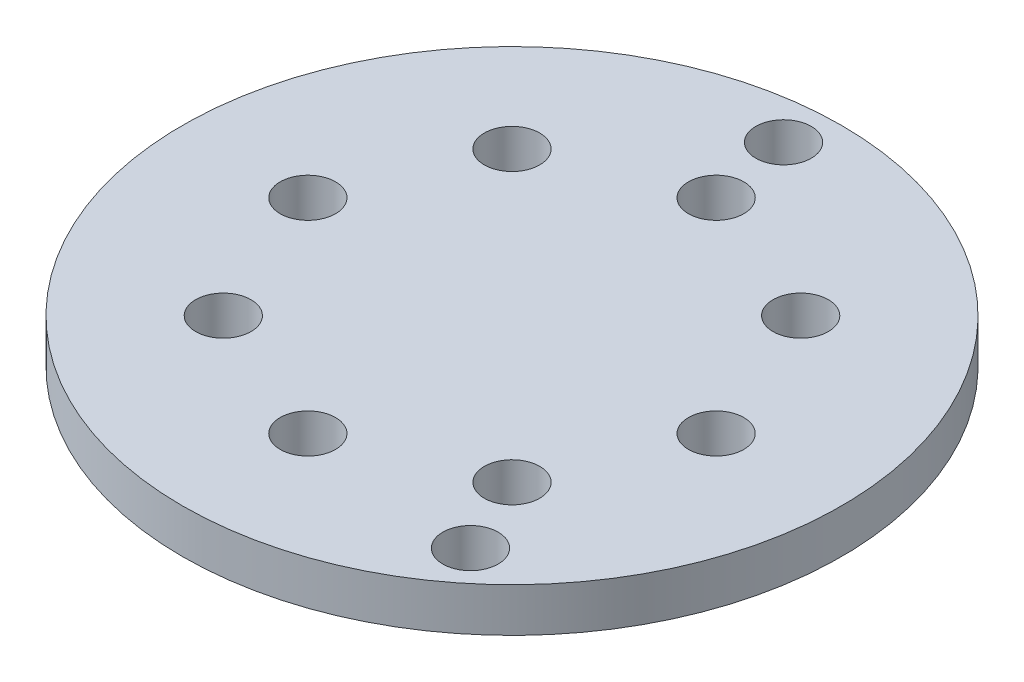
ISO-10303-21;
HEADER;
FILE_DESCRIPTION(('STEP AP214'),'2;1');
FILE_NAME('part.step','',(''),(''),'','','');
FILE_SCHEMA(('AUTOMOTIVE_DESIGN { 1 0 10303 214 1 1 1 1 }'));
ENDSEC;
DATA;
#1=APPLICATION_CONTEXT('core data for automotive mechanical design processes');
#2=APPLICATION_PROTOCOL_DEFINITION('international standard','automotive_design',2000,#1);
#3=PRODUCT_CONTEXT('',#1,'mechanical');
#4=PRODUCT('Part','Part','',(#3));
#5=PRODUCT_RELATED_PRODUCT_CATEGORY('part','',(#4));
#6=PRODUCT_DEFINITION_FORMATION('','',#4);
#7=PRODUCT_DEFINITION_CONTEXT('part definition',#1,'design');
#8=PRODUCT_DEFINITION('design','',#6,#7);
#9=PRODUCT_DEFINITION_SHAPE('','',#8);
#10=(LENGTH_UNIT() NAMED_UNIT(*) SI_UNIT(.MILLI.,.METRE.));
#11=(NAMED_UNIT(*) PLANE_ANGLE_UNIT() SI_UNIT($,.RADIAN.));
#12=(NAMED_UNIT(*) SI_UNIT($,.STERADIAN.) SOLID_ANGLE_UNIT());
#13=UNCERTAINTY_MEASURE_WITH_UNIT(LENGTH_MEASURE(1.E-05),#10,'distance_accuracy_value','');
#14=(GEOMETRIC_REPRESENTATION_CONTEXT(3) GLOBAL_UNCERTAINTY_ASSIGNED_CONTEXT((#13)) GLOBAL_UNIT_ASSIGNED_CONTEXT((#10,
#11,#12)) REPRESENTATION_CONTEXT('',''));
#15=CARTESIAN_POINT('',(0.,0.,0.));
#16=DIRECTION('',(0.,0.,1.));
#17=DIRECTION('',(1.,0.,0.));
#18=AXIS2_PLACEMENT_3D('',#15,#16,#17);
#19=CARTESIAN_POINT('',(0.,6.35,0.));
#20=DIRECTION('',(0.,-1.,0.));
#21=DIRECTION('',(0.,0.,-1.));
#22=AXIS2_PLACEMENT_3D('',#19,#20,#21);
#23=CYLINDRICAL_SURFACE('',#22,47.625);
#24=CARTESIAN_POINT('',(0.,6.35,0.));
#25=DIRECTION('',(0.,1.,0.));
#26=DIRECTION('',(0.,0.,1.));
#27=AXIS2_PLACEMENT_3D('',#24,#25,#26);
#28=CIRCLE('',#27,47.625);
#29=CARTESIAN_POINT('',(0.,6.35,47.625));
#30=VERTEX_POINT('',#29);
#31=EDGE_CURVE('E10',#30,#30,#28,.T.);
#32=ORIENTED_EDGE('',*,*,#31,.F.);
#33=EDGE_LOOP('',(#32));
#34=FACE_BOUND('',#33,.T.);
#35=CARTESIAN_POINT('',(0.,0.,0.));
#36=DIRECTION('',(0.,1.,0.));
#37=DIRECTION('',(0.,0.,1.));
#38=AXIS2_PLACEMENT_3D('',#35,#36,#37);
#39=CIRCLE('',#38,47.625);
#40=CARTESIAN_POINT('',(0.,0.,47.625));
#41=VERTEX_POINT('',#40);
#42=EDGE_CURVE('E48',#41,#41,#39,.T.);
#43=ORIENTED_EDGE('',*,*,#42,.T.);
#44=EDGE_LOOP('',(#43));
#45=FACE_BOUND('',#44,.T.);
#46=ADVANCED_FACE('F45',(#34,#45),#23,.T.);
#47=CARTESIAN_POINT('',(0.,6.35,0.));
#48=DIRECTION('',(0.,1.,0.));
#49=DIRECTION('',(0.,0.,1.));
#50=AXIS2_PLACEMENT_3D('',#47,#48,#49);
#51=PLANE('',#50);
#52=CARTESIAN_POINT('',(26.0949031134328,6.35,32.0940532608543));
#53=DIRECTION('',(0.,1.,0.));
#54=DIRECTION('',(0.,0.,1.));
#55=AXIS2_PLACEMENT_3D('',#52,#53,#54);
#56=CIRCLE('',#55,4.);
#57=CARTESIAN_POINT('',(26.0949031134328,6.35,36.0940532608543));
#58=VERTEX_POINT('',#57);
#59=EDGE_CURVE('E131',#58,#58,#56,.T.);
#60=ORIENTED_EDGE('',*,*,#59,.F.);
#61=EDGE_LOOP('',(#60));
#62=FACE_BOUND('',#61,.T.);
#63=CARTESIAN_POINT('',(-2.07250568925483,6.35,-41.3119467391456));
#64=DIRECTION('',(0.,1.,0.));
#65=DIRECTION('',(0.,0.,1.));
#66=AXIS2_PLACEMENT_3D('',#63,#64,#65);
#67=CIRCLE('',#66,4.);
#68=CARTESIAN_POINT('',(-2.07250568925483,6.35,-37.3119467391456));
#69=VERTEX_POINT('',#68);
#70=EDGE_CURVE('E123',#69,#69,#67,.T.);
#71=ORIENTED_EDGE('',*,*,#70,.F.);
#72=EDGE_LOOP('',(#71));
#73=FACE_BOUND('',#72,.T.);
#74=CARTESIAN_POINT('',(1.02998699495872E-13,6.35,29.5));
#75=DIRECTION('',(0.,1.,0.));
#76=DIRECTION('',(1.,0.,0.));
#77=AXIS2_PLACEMENT_3D('',#74,#75,#76);
#78=CIRCLE('',#77,4.);
#79=CARTESIAN_POINT('',(4.0000000000001,6.35,29.5));
#80=VERTEX_POINT('',#79);
#81=EDGE_CURVE('E100',#80,#80,#78,.T.);
#82=ORIENTED_EDGE('',*,*,#81,.F.);
#83=EDGE_LOOP('',(#82));
#84=FACE_BOUND('',#83,.T.);
#85=CARTESIAN_POINT('',(20.8596500450033,6.35,20.859650045003));
#86=DIRECTION('',(0.,1.,0.));
#87=DIRECTION('',(0.707106781186544,0.,-0.707106781186551));
#88=AXIS2_PLACEMENT_3D('',#85,#86,#87);
#89=CIRCLE('',#88,4.);
#90=CARTESIAN_POINT('',(23.6880771697494,6.35,18.0312229202568));
#91=VERTEX_POINT('',#90);
#92=EDGE_CURVE('E92',#91,#91,#89,.T.);
#93=ORIENTED_EDGE('',*,*,#92,.F.);
#94=EDGE_LOOP('',(#93));
#95=FACE_BOUND('',#94,.T.);
#96=CARTESIAN_POINT('',(29.5,6.35,0.));
#97=DIRECTION('',(0.,1.,0.));
#98=DIRECTION('',(0.,0.,-1.));
#99=AXIS2_PLACEMENT_3D('',#96,#97,#98);
#100=CIRCLE('',#99,4.);
#101=CARTESIAN_POINT('',(29.5,6.35,-4.));
#102=VERTEX_POINT('',#101);
#103=EDGE_CURVE('E84',#102,#102,#100,.T.);
#104=ORIENTED_EDGE('',*,*,#103,.F.);
#105=EDGE_LOOP('',(#104));
#106=FACE_BOUND('',#105,.T.);
#107=CARTESIAN_POINT('',(20.859650045003,6.35,-20.8596500450033));
#108=DIRECTION('',(0.,1.,0.));
#109=DIRECTION('',(-0.707106781186554,0.,-0.707106781186541));
#110=AXIS2_PLACEMENT_3D('',#107,#108,#109);
#111=CIRCLE('',#110,4.);
#112=CARTESIAN_POINT('',(18.0312229202568,6.35,-23.6880771697495));
#113=VERTEX_POINT('',#112);
#114=EDGE_CURVE('E75',#113,#113,#111,.T.);
#115=ORIENTED_EDGE('',*,*,#114,.F.);
#116=EDGE_LOOP('',(#115));
#117=FACE_BOUND('',#116,.T.);
#118=CARTESIAN_POINT('',(-3.08996098487617E-13,6.35,-29.5));
#119=DIRECTION('',(0.,1.,0.));
#120=DIRECTION('',(-1.,0.,0.));
#121=AXIS2_PLACEMENT_3D('',#118,#119,#120);
#122=CIRCLE('',#121,4.);
#123=CARTESIAN_POINT('',(-4.00000000000031,6.35,-29.5));
#124=VERTEX_POINT('',#123);
#125=EDGE_CURVE('E116',#124,#124,#122,.T.);
#126=ORIENTED_EDGE('',*,*,#125,.F.);
#127=EDGE_LOOP('',(#126));
#128=FACE_BOUND('',#127,.T.);
#129=CARTESIAN_POINT('',(-20.8596500450034,6.35,-20.8596500450029));
#130=DIRECTION('',(0.,1.,0.));
#131=DIRECTION('',(-0.707106781186539,0.,0.707106781186556));
#132=AXIS2_PLACEMENT_3D('',#129,#130,#131);
#133=CIRCLE('',#132,4.);
#134=CARTESIAN_POINT('',(-23.6880771697496,6.35,-18.0312229202567));
#135=VERTEX_POINT('',#134);
#136=EDGE_CURVE('E107',#135,#135,#133,.T.);
#137=ORIENTED_EDGE('',*,*,#136,.F.);
#138=EDGE_LOOP('',(#137));
#139=FACE_BOUND('',#138,.T.);
#140=CARTESIAN_POINT('',(-20.8596500450031,6.35,20.8596500450032));
#141=DIRECTION('',(0.,1.,0.));
#142=DIRECTION('',(0.707106781186549,0.,0.707106781186546));
#143=AXIS2_PLACEMENT_3D('',#140,#141,#142);
#144=CIRCLE('',#143,4.);
#145=CARTESIAN_POINT('',(-18.0312229202569,6.35,23.6880771697494));
#146=VERTEX_POINT('',#145);
#147=EDGE_CURVE('E67',#146,#146,#144,.T.);
#148=ORIENTED_EDGE('',*,*,#147,.F.);
#149=EDGE_LOOP('',(#148));
#150=FACE_BOUND('',#149,.T.);
#151=CARTESIAN_POINT('',(-29.5,6.35,0.));
#152=DIRECTION('',(0.,1.,0.));
#153=DIRECTION('',(0.,0.,1.));
#154=AXIS2_PLACEMENT_3D('',#151,#152,#153);
#155=CIRCLE('',#154,4.);
#156=CARTESIAN_POINT('',(-29.5,6.35,4.));
#157=VERTEX_POINT('',#156);
#158=EDGE_CURVE('E59',#157,#157,#155,.T.);
#159=ORIENTED_EDGE('',*,*,#158,.F.);
#160=EDGE_LOOP('',(#159));
#161=FACE_BOUND('',#160,.T.);
#162=ORIENTED_EDGE('',*,*,#31,.T.);
#163=EDGE_LOOP('',(#162));
#164=FACE_BOUND('',#163,.T.);
#165=ADVANCED_FACE('F149',(#62,#73,#84,#95,#106,#117,#128,#139,#150,#161,#164),#51,.T.);
#166=CARTESIAN_POINT('',(0.,0.,0.));
#167=DIRECTION('',(0.,1.,0.));
#168=DIRECTION('',(0.,0.,1.));
#169=AXIS2_PLACEMENT_3D('',#166,#167,#168);
#170=PLANE('',#169);
#171=CARTESIAN_POINT('',(26.0949031134328,0.,32.0940532608543));
#172=DIRECTION('',(0.,1.,0.));
#173=DIRECTION('',(0.,0.,1.));
#174=AXIS2_PLACEMENT_3D('',#171,#172,#173);
#175=CIRCLE('',#174,4.);
#176=CARTESIAN_POINT('',(26.0949031134328,0.,36.0940532608543));
#177=VERTEX_POINT('',#176);
#178=EDGE_CURVE('E127',#177,#177,#175,.T.);
#179=ORIENTED_EDGE('',*,*,#178,.T.);
#180=EDGE_LOOP('',(#179));
#181=FACE_BOUND('',#180,.T.);
#182=CARTESIAN_POINT('',(-2.07250568925483,0.,-41.3119467391456));
#183=DIRECTION('',(0.,1.,0.));
#184=DIRECTION('',(0.,0.,1.));
#185=AXIS2_PLACEMENT_3D('',#182,#183,#184);
#186=CIRCLE('',#185,4.);
#187=CARTESIAN_POINT('',(-2.07250568925483,0.,-37.3119467391456));
#188=VERTEX_POINT('',#187);
#189=EDGE_CURVE('E112',#188,#188,#186,.T.);
#190=ORIENTED_EDGE('',*,*,#189,.T.);
#191=EDGE_LOOP('',(#190));
#192=FACE_BOUND('',#191,.T.);
#193=CARTESIAN_POINT('',(1.02998699495872E-13,0.,29.5));
#194=DIRECTION('',(0.,1.,0.));
#195=DIRECTION('',(1.,0.,0.));
#196=AXIS2_PLACEMENT_3D('',#193,#194,#195);
#197=CIRCLE('',#196,4.);
#198=CARTESIAN_POINT('',(4.0000000000001,0.,29.5));
#199=VERTEX_POINT('',#198);
#200=EDGE_CURVE('E71',#199,#199,#197,.T.);
#201=ORIENTED_EDGE('',*,*,#200,.T.);
#202=EDGE_LOOP('',(#201));
#203=FACE_BOUND('',#202,.T.);
#204=CARTESIAN_POINT('',(20.8596500450033,0.,20.859650045003));
#205=DIRECTION('',(0.,1.,0.));
#206=DIRECTION('',(0.707106781186544,0.,-0.707106781186551));
#207=AXIS2_PLACEMENT_3D('',#204,#205,#206);
#208=CIRCLE('',#207,4.);
#209=CARTESIAN_POINT('',(23.6880771697494,0.,18.0312229202568));
#210=VERTEX_POINT('',#209);
#211=EDGE_CURVE('E96',#210,#210,#208,.T.);
#212=ORIENTED_EDGE('',*,*,#211,.T.);
#213=EDGE_LOOP('',(#212));
#214=FACE_BOUND('',#213,.T.);
#215=CARTESIAN_POINT('',(29.5,0.,0.));
#216=DIRECTION('',(0.,1.,0.));
#217=DIRECTION('',(0.,0.,-1.));
#218=AXIS2_PLACEMENT_3D('',#215,#216,#217);
#219=CIRCLE('',#218,4.);
#220=CARTESIAN_POINT('',(29.5,0.,-4.));
#221=VERTEX_POINT('',#220);
#222=EDGE_CURVE('E88',#221,#221,#219,.T.);
#223=ORIENTED_EDGE('',*,*,#222,.T.);
#224=EDGE_LOOP('',(#223));
#225=FACE_BOUND('',#224,.T.);
#226=CARTESIAN_POINT('',(20.859650045003,0.,-20.8596500450033));
#227=DIRECTION('',(0.,1.,0.));
#228=DIRECTION('',(-0.707106781186554,0.,-0.707106781186541));
#229=AXIS2_PLACEMENT_3D('',#226,#227,#228);
#230=CIRCLE('',#229,4.);
#231=CARTESIAN_POINT('',(18.0312229202568,0.,-23.6880771697495));
#232=VERTEX_POINT('',#231);
#233=EDGE_CURVE('E79',#232,#232,#230,.T.);
#234=ORIENTED_EDGE('',*,*,#233,.T.);
#235=EDGE_LOOP('',(#234));
#236=FACE_BOUND('',#235,.T.);
#237=CARTESIAN_POINT('',(-3.08996098487617E-13,0.,-29.5));
#238=DIRECTION('',(0.,1.,0.));
#239=DIRECTION('',(-1.,0.,0.));
#240=AXIS2_PLACEMENT_3D('',#237,#238,#239);
#241=CIRCLE('',#240,4.);
#242=CARTESIAN_POINT('',(-4.00000000000031,0.,-29.5));
#243=VERTEX_POINT('',#242);
#244=EDGE_CURVE('E80',#243,#243,#241,.T.);
#245=ORIENTED_EDGE('',*,*,#244,.T.);
#246=EDGE_LOOP('',(#245));
#247=FACE_BOUND('',#246,.T.);
#248=CARTESIAN_POINT('',(-20.8596500450034,0.,-20.8596500450029));
#249=DIRECTION('',(0.,1.,0.));
#250=DIRECTION('',(-0.707106781186539,0.,0.707106781186556));
#251=AXIS2_PLACEMENT_3D('',#248,#249,#250);
#252=CIRCLE('',#251,4.);
#253=CARTESIAN_POINT('',(-23.6880771697496,0.,-18.0312229202567));
#254=VERTEX_POINT('',#253);
#255=EDGE_CURVE('E111',#254,#254,#252,.T.);
#256=ORIENTED_EDGE('',*,*,#255,.T.);
#257=EDGE_LOOP('',(#256));
#258=FACE_BOUND('',#257,.T.);
#259=CARTESIAN_POINT('',(-20.8596500450031,0.,20.8596500450032));
#260=DIRECTION('',(0.,1.,0.));
#261=DIRECTION('',(0.707106781186549,0.,0.707106781186546));
#262=AXIS2_PLACEMENT_3D('',#259,#260,#261);
#263=CIRCLE('',#262,4.);
#264=CARTESIAN_POINT('',(-18.0312229202569,0.,23.6880771697494));
#265=VERTEX_POINT('',#264);
#266=EDGE_CURVE('E63',#265,#265,#263,.T.);
#267=ORIENTED_EDGE('',*,*,#266,.T.);
#268=EDGE_LOOP('',(#267));
#269=FACE_BOUND('',#268,.T.);
#270=CARTESIAN_POINT('',(-29.5,0.,0.));
#271=DIRECTION('',(0.,1.,0.));
#272=DIRECTION('',(0.,0.,1.));
#273=AXIS2_PLACEMENT_3D('',#270,#271,#272);
#274=CIRCLE('',#273,4.);
#275=CARTESIAN_POINT('',(-29.5,0.,4.));
#276=VERTEX_POINT('',#275);
#277=EDGE_CURVE('E57',#276,#276,#274,.T.);
#278=ORIENTED_EDGE('',*,*,#277,.T.);
#279=EDGE_LOOP('',(#278));
#280=FACE_BOUND('',#279,.T.);
#281=ORIENTED_EDGE('',*,*,#42,.F.);
#282=EDGE_LOOP('',(#281));
#283=FACE_BOUND('',#282,.T.);
#284=ADVANCED_FACE('F139',(#181,#192,#203,#214,#225,#236,#247,#258,#269,#280,#283),#170,.F.);
#285=CARTESIAN_POINT('',(-29.5,0.,0.));
#286=DIRECTION('',(0.,1.,0.));
#287=DIRECTION('',(0.,0.,1.));
#288=AXIS2_PLACEMENT_3D('',#285,#286,#287);
#289=CYLINDRICAL_SURFACE('',#288,4.);
#290=ORIENTED_EDGE('',*,*,#277,.F.);
#291=EDGE_LOOP('',(#290));
#292=FACE_BOUND('',#291,.T.);
#293=ORIENTED_EDGE('',*,*,#158,.T.);
#294=EDGE_LOOP('',(#293));
#295=FACE_BOUND('',#294,.T.);
#296=ADVANCED_FACE('F171',(#292,#295),#289,.F.);
#297=CARTESIAN_POINT('',(-20.8596500450031,0.,20.8596500450032));
#298=DIRECTION('',(0.,1.,0.));
#299=DIRECTION('',(0.,0.,1.));
#300=AXIS2_PLACEMENT_3D('',#297,#298,#299);
#301=CYLINDRICAL_SURFACE('',#300,4.);
#302=ORIENTED_EDGE('',*,*,#266,.F.);
#303=EDGE_LOOP('',(#302));
#304=FACE_BOUND('',#303,.T.);
#305=ORIENTED_EDGE('',*,*,#147,.T.);
#306=EDGE_LOOP('',(#305));
#307=FACE_BOUND('',#306,.T.);
#308=ADVANCED_FACE('F173',(#304,#307),#301,.F.);
#309=CARTESIAN_POINT('',(-20.8596500450034,0.,-20.8596500450029));
#310=DIRECTION('',(0.,1.,0.));
#311=DIRECTION('',(0.,0.,1.));
#312=AXIS2_PLACEMENT_3D('',#309,#310,#311);
#313=CYLINDRICAL_SURFACE('',#312,4.);
#314=ORIENTED_EDGE('',*,*,#255,.F.);
#315=EDGE_LOOP('',(#314));
#316=FACE_BOUND('',#315,.T.);
#317=ORIENTED_EDGE('',*,*,#136,.T.);
#318=EDGE_LOOP('',(#317));
#319=FACE_BOUND('',#318,.T.);
#320=ADVANCED_FACE('F180',(#316,#319),#313,.F.);
#321=CARTESIAN_POINT('',(-3.08996098487617E-13,0.,-29.5));
#322=DIRECTION('',(0.,1.,0.));
#323=DIRECTION('',(0.,0.,1.));
#324=AXIS2_PLACEMENT_3D('',#321,#322,#323);
#325=CYLINDRICAL_SURFACE('',#324,4.);
#326=ORIENTED_EDGE('',*,*,#244,.F.);
#327=EDGE_LOOP('',(#326));
#328=FACE_BOUND('',#327,.T.);
#329=ORIENTED_EDGE('',*,*,#125,.T.);
#330=EDGE_LOOP('',(#329));
#331=FACE_BOUND('',#330,.T.);
#332=ADVANCED_FACE('F251',(#328,#331),#325,.F.);
#333=CARTESIAN_POINT('',(20.859650045003,0.,-20.8596500450033));
#334=DIRECTION('',(0.,1.,0.));
#335=DIRECTION('',(0.,0.,1.));
#336=AXIS2_PLACEMENT_3D('',#333,#334,#335);
#337=CYLINDRICAL_SURFACE('',#336,4.);
#338=ORIENTED_EDGE('',*,*,#233,.F.);
#339=EDGE_LOOP('',(#338));
#340=FACE_BOUND('',#339,.T.);
#341=ORIENTED_EDGE('',*,*,#114,.T.);
#342=EDGE_LOOP('',(#341));
#343=FACE_BOUND('',#342,.T.);
#344=ADVANCED_FACE('F243',(#340,#343),#337,.F.);
#345=CARTESIAN_POINT('',(29.5,0.,0.));
#346=DIRECTION('',(0.,1.,0.));
#347=DIRECTION('',(0.,0.,1.));
#348=AXIS2_PLACEMENT_3D('',#345,#346,#347);
#349=CYLINDRICAL_SURFACE('',#348,4.);
#350=ORIENTED_EDGE('',*,*,#222,.F.);
#351=EDGE_LOOP('',(#350));
#352=FACE_BOUND('',#351,.T.);
#353=ORIENTED_EDGE('',*,*,#103,.T.);
#354=EDGE_LOOP('',(#353));
#355=FACE_BOUND('',#354,.T.);
#356=ADVANCED_FACE('F235',(#352,#355),#349,.F.);
#357=CARTESIAN_POINT('',(20.8596500450033,0.,20.859650045003));
#358=DIRECTION('',(0.,1.,0.));
#359=DIRECTION('',(0.,0.,1.));
#360=AXIS2_PLACEMENT_3D('',#357,#358,#359);
#361=CYLINDRICAL_SURFACE('',#360,4.);
#362=ORIENTED_EDGE('',*,*,#211,.F.);
#363=EDGE_LOOP('',(#362));
#364=FACE_BOUND('',#363,.T.);
#365=ORIENTED_EDGE('',*,*,#92,.T.);
#366=EDGE_LOOP('',(#365));
#367=FACE_BOUND('',#366,.T.);
#368=ADVANCED_FACE('F227',(#364,#367),#361,.F.);
#369=CARTESIAN_POINT('',(1.02998699495872E-13,0.,29.5));
#370=DIRECTION('',(0.,1.,0.));
#371=DIRECTION('',(0.,0.,1.));
#372=AXIS2_PLACEMENT_3D('',#369,#370,#371);
#373=CYLINDRICAL_SURFACE('',#372,4.);
#374=ORIENTED_EDGE('',*,*,#200,.F.);
#375=EDGE_LOOP('',(#374));
#376=FACE_BOUND('',#375,.T.);
#377=ORIENTED_EDGE('',*,*,#81,.T.);
#378=EDGE_LOOP('',(#377));
#379=FACE_BOUND('',#378,.T.);
#380=ADVANCED_FACE('F220',(#376,#379),#373,.F.);
#381=CARTESIAN_POINT('',(-2.07250568925483,0.,-41.3119467391456));
#382=DIRECTION('',(0.,1.,0.));
#383=DIRECTION('',(0.,0.,1.));
#384=AXIS2_PLACEMENT_3D('',#381,#382,#383);
#385=CYLINDRICAL_SURFACE('',#384,4.);
#386=ORIENTED_EDGE('',*,*,#189,.F.);
#387=EDGE_LOOP('',(#386));
#388=FACE_BOUND('',#387,.T.);
#389=ORIENTED_EDGE('',*,*,#70,.T.);
#390=EDGE_LOOP('',(#389));
#391=FACE_BOUND('',#390,.T.);
#392=ADVANCED_FACE('F145',(#388,#391),#385,.F.);
#393=CARTESIAN_POINT('',(26.0949031134328,0.,32.0940532608543));
#394=DIRECTION('',(0.,1.,0.));
#395=DIRECTION('',(0.,0.,1.));
#396=AXIS2_PLACEMENT_3D('',#393,#394,#395);
#397=CYLINDRICAL_SURFACE('',#396,4.);
#398=ORIENTED_EDGE('',*,*,#178,.F.);
#399=EDGE_LOOP('',(#398));
#400=FACE_BOUND('',#399,.T.);
#401=ORIENTED_EDGE('',*,*,#59,.T.);
#402=EDGE_LOOP('',(#401));
#403=FACE_BOUND('',#402,.T.);
#404=ADVANCED_FACE('F142',(#400,#403),#397,.F.);
#405=CLOSED_SHELL('',(#46,#165,#284,#296,#308,#320,#332,#344,#356,#368,#380,#392,#404));
#406=MANIFOLD_SOLID_BREP('B2',#405);
#407=ADVANCED_BREP_SHAPE_REPRESENTATION('',(#18,#406),#14);
#408=SHAPE_DEFINITION_REPRESENTATION(#9,#407);
ENDSEC;
END-ISO-10303-21;
